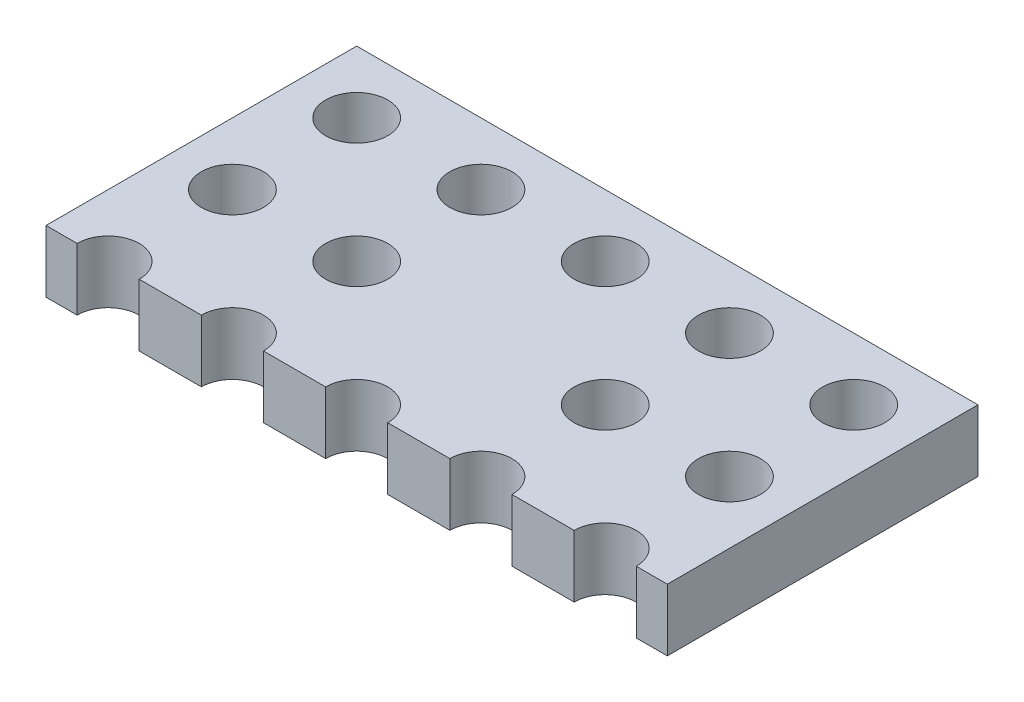
ISO-10303-21;
HEADER;
FILE_DESCRIPTION(('STEP AP214'),'2;1');
FILE_NAME('part.step','',(''),(''),'','','');
FILE_SCHEMA(('AUTOMOTIVE_DESIGN { 1 0 10303 214 1 1 1 1 }'));
ENDSEC;
DATA;
#1=APPLICATION_CONTEXT('core data for automotive mechanical design processes');
#2=APPLICATION_PROTOCOL_DEFINITION('international standard','automotive_design',2000,#1);
#3=PRODUCT_CONTEXT('',#1,'mechanical');
#4=PRODUCT('Part','Part','',(#3));
#5=PRODUCT_RELATED_PRODUCT_CATEGORY('part','',(#4));
#6=PRODUCT_DEFINITION_FORMATION('','',#4);
#7=PRODUCT_DEFINITION_CONTEXT('part definition',#1,'design');
#8=PRODUCT_DEFINITION('design','',#6,#7);
#9=PRODUCT_DEFINITION_SHAPE('','',#8);
#10=(LENGTH_UNIT() NAMED_UNIT(*) SI_UNIT(.MILLI.,.METRE.));
#11=(NAMED_UNIT(*) PLANE_ANGLE_UNIT() SI_UNIT($,.RADIAN.));
#12=(NAMED_UNIT(*) SI_UNIT($,.STERADIAN.) SOLID_ANGLE_UNIT());
#13=UNCERTAINTY_MEASURE_WITH_UNIT(LENGTH_MEASURE(1.E-05),#10,'distance_accuracy_value','');
#14=(GEOMETRIC_REPRESENTATION_CONTEXT(3) GLOBAL_UNCERTAINTY_ASSIGNED_CONTEXT((#13)) GLOBAL_UNIT_ASSIGNED_CONTEXT((#10,
#11,#12)) REPRESENTATION_CONTEXT('',''));
#15=CARTESIAN_POINT('',(0.,0.,0.));
#16=DIRECTION('',(0.,0.,1.));
#17=DIRECTION('',(1.,0.,0.));
#18=AXIS2_PLACEMENT_3D('',#15,#16,#17);
#19=CARTESIAN_POINT('',(-50.,10.,25.));
#20=DIRECTION('',(0.,0.,-1.));
#21=DIRECTION('',(-1.,0.,0.));
#22=AXIS2_PLACEMENT_3D('',#19,#20,#21);
#23=PLANE('',#22);
#24=DIRECTION('',(1.,0.,0.));
#25=VECTOR('',#24,1.);
#26=CARTESIAN_POINT('',(-50.,0.,25.));
#27=LINE('',#26,#25);
#28=CARTESIAN_POINT('',(-50.,0.,25.));
#29=VERTEX_POINT('',#28);
#30=CARTESIAN_POINT('',(-45.,0.,25.));
#31=VERTEX_POINT('',#30);
#32=EDGE_CURVE('E171',#29,#31,#27,.T.);
#33=ORIENTED_EDGE('',*,*,#32,.T.);
#34=DIRECTION('',(0.,1.,0.));
#35=VECTOR('',#34,1.);
#36=CARTESIAN_POINT('',(-45.,0.,25.));
#37=LINE('',#36,#35);
#38=CARTESIAN_POINT('',(-45.,10.,25.));
#39=VERTEX_POINT('',#38);
#40=EDGE_CURVE('E248',#31,#39,#37,.T.);
#41=ORIENTED_EDGE('',*,*,#40,.T.);
#42=DIRECTION('',(1.,0.,0.));
#43=VECTOR('',#42,1.);
#44=CARTESIAN_POINT('',(-50.,10.,25.));
#45=LINE('',#44,#43);
#46=CARTESIAN_POINT('',(-50.,10.,25.));
#47=VERTEX_POINT('',#46);
#48=EDGE_CURVE('E272',#47,#39,#45,.T.);
#49=ORIENTED_EDGE('',*,*,#48,.F.);
#50=DIRECTION('',(0.,-1.,0.));
#51=VECTOR('',#50,1.);
#52=CARTESIAN_POINT('',(-50.,10.,25.));
#53=LINE('',#52,#51);
#54=EDGE_CURVE('E295',#47,#29,#53,.T.);
#55=ORIENTED_EDGE('',*,*,#54,.T.);
#56=EDGE_LOOP('',(#33,#41,#49,#55));
#57=FACE_BOUND('',#56,.T.);
#58=ADVANCED_FACE('F39',(#57),#23,.F.);
#59=CARTESIAN_POINT('',(-35.,10.,25.));
#60=VERTEX_POINT('',#59);
#61=CARTESIAN_POINT('',(-25.,10.,25.));
#62=VERTEX_POINT('',#61);
#63=EDGE_CURVE('E277',#60,#62,#45,.T.);
#64=ORIENTED_EDGE('',*,*,#63,.F.);
#65=DIRECTION('',(0.,1.,0.));
#66=VECTOR('',#65,1.);
#67=CARTESIAN_POINT('',(-35.,0.,25.));
#68=LINE('',#67,#66);
#69=CARTESIAN_POINT('',(-35.,0.,25.));
#70=VERTEX_POINT('',#69);
#71=EDGE_CURVE('E245',#60,#70,#68,.F.);
#72=ORIENTED_EDGE('',*,*,#71,.T.);
#73=CARTESIAN_POINT('',(-25.,0.,25.));
#74=VERTEX_POINT('',#73);
#75=EDGE_CURVE('E181',#70,#74,#27,.T.);
#76=ORIENTED_EDGE('',*,*,#75,.T.);
#77=DIRECTION('',(0.,1.,0.));
#78=VECTOR('',#77,1.);
#79=CARTESIAN_POINT('',(-25.,0.,25.));
#80=LINE('',#79,#78);
#81=EDGE_CURVE('E242',#74,#62,#80,.T.);
#82=ORIENTED_EDGE('',*,*,#81,.T.);
#83=EDGE_LOOP('',(#64,#72,#76,#82));
#84=FACE_BOUND('',#83,.T.);
#85=ADVANCED_FACE('F319',(#84),#23,.F.);
#86=CARTESIAN_POINT('',(-15.,10.,25.));
#87=VERTEX_POINT('',#86);
#88=CARTESIAN_POINT('',(-4.99999999999999,10.,25.));
#89=VERTEX_POINT('',#88);
#90=EDGE_CURVE('E324',#87,#89,#45,.T.);
#91=ORIENTED_EDGE('',*,*,#90,.F.);
#92=DIRECTION('',(0.,1.,0.));
#93=VECTOR('',#92,1.);
#94=CARTESIAN_POINT('',(-15.,0.,25.));
#95=LINE('',#94,#93);
#96=CARTESIAN_POINT('',(-15.,0.,25.));
#97=VERTEX_POINT('',#96);
#98=EDGE_CURVE('E239',#87,#97,#95,.F.);
#99=ORIENTED_EDGE('',*,*,#98,.T.);
#100=CARTESIAN_POINT('',(-4.99999999999999,0.,25.));
#101=VERTEX_POINT('',#100);
#102=EDGE_CURVE('E192',#97,#101,#27,.T.);
#103=ORIENTED_EDGE('',*,*,#102,.T.);
#104=DIRECTION('',(0.,1.,0.));
#105=VECTOR('',#104,1.);
#106=CARTESIAN_POINT('',(-4.99999999999999,0.,25.));
#107=LINE('',#106,#105);
#108=EDGE_CURVE('E236',#101,#89,#107,.T.);
#109=ORIENTED_EDGE('',*,*,#108,.T.);
#110=EDGE_LOOP('',(#91,#99,#103,#109));
#111=FACE_BOUND('',#110,.T.);
#112=ADVANCED_FACE('F418',(#111),#23,.F.);
#113=CARTESIAN_POINT('',(5.,10.,25.));
#114=VERTEX_POINT('',#113);
#115=CARTESIAN_POINT('',(15.,10.,25.));
#116=VERTEX_POINT('',#115);
#117=EDGE_CURVE('E326',#114,#116,#45,.T.);
#118=ORIENTED_EDGE('',*,*,#117,.F.);
#119=DIRECTION('',(0.,1.,0.));
#120=VECTOR('',#119,1.);
#121=CARTESIAN_POINT('',(5.,0.,25.));
#122=LINE('',#121,#120);
#123=CARTESIAN_POINT('',(5.,0.,25.));
#124=VERTEX_POINT('',#123);
#125=EDGE_CURVE('E211',#114,#124,#122,.F.);
#126=ORIENTED_EDGE('',*,*,#125,.T.);
#127=CARTESIAN_POINT('',(15.,0.,25.));
#128=VERTEX_POINT('',#127);
#129=EDGE_CURVE('E174',#124,#128,#27,.T.);
#130=ORIENTED_EDGE('',*,*,#129,.T.);
#131=DIRECTION('',(0.,1.,0.));
#132=VECTOR('',#131,1.);
#133=CARTESIAN_POINT('',(15.,0.,25.));
#134=LINE('',#133,#132);
#135=EDGE_CURVE('E63',#128,#116,#134,.T.);
#136=ORIENTED_EDGE('',*,*,#135,.T.);
#137=EDGE_LOOP('',(#118,#126,#130,#136));
#138=FACE_BOUND('',#137,.T.);
#139=ADVANCED_FACE('F209',(#138),#23,.F.);
#140=CARTESIAN_POINT('',(25.,10.,25.));
#141=VERTEX_POINT('',#140);
#142=CARTESIAN_POINT('',(35.,10.,25.));
#143=VERTEX_POINT('',#142);
#144=EDGE_CURVE('E329',#141,#143,#45,.T.);
#145=ORIENTED_EDGE('',*,*,#144,.F.);
#146=DIRECTION('',(0.,1.,0.));
#147=VECTOR('',#146,1.);
#148=CARTESIAN_POINT('',(25.,0.,25.));
#149=LINE('',#148,#147);
#150=CARTESIAN_POINT('',(25.,0.,25.));
#151=VERTEX_POINT('',#150);
#152=EDGE_CURVE('E229',#141,#151,#149,.F.);
#153=ORIENTED_EDGE('',*,*,#152,.T.);
#154=CARTESIAN_POINT('',(35.,0.,25.));
#155=VERTEX_POINT('',#154);
#156=EDGE_CURVE('E168',#151,#155,#27,.T.);
#157=ORIENTED_EDGE('',*,*,#156,.T.);
#158=DIRECTION('',(0.,1.,0.));
#159=VECTOR('',#158,1.);
#160=CARTESIAN_POINT('',(35.,0.,25.));
#161=LINE('',#160,#159);
#162=EDGE_CURVE('E55',#155,#143,#161,.T.);
#163=ORIENTED_EDGE('',*,*,#162,.T.);
#164=EDGE_LOOP('',(#145,#153,#157,#163));
#165=FACE_BOUND('',#164,.T.);
#166=ADVANCED_FACE('F398',(#165),#23,.F.);
#167=CARTESIAN_POINT('',(40.,0.,5.00000000000001));
#168=DIRECTION('',(0.,1.,0.));
#169=DIRECTION('',(0.,0.,1.));
#170=AXIS2_PLACEMENT_3D('',#167,#168,#169);
#171=CYLINDRICAL_SURFACE('',#170,5.);
#172=CARTESIAN_POINT('',(40.,0.,5.00000000000001));
#173=DIRECTION('',(0.,1.,0.));
#174=DIRECTION('',(0.,0.,1.));
#175=AXIS2_PLACEMENT_3D('',#172,#173,#174);
#176=CIRCLE('',#175,5.);
#177=CARTESIAN_POINT('',(40.,0.,10.));
#178=VERTEX_POINT('',#177);
#179=EDGE_CURVE('E48',#178,#178,#176,.T.);
#180=ORIENTED_EDGE('',*,*,#179,.F.);
#181=EDGE_LOOP('',(#180));
#182=FACE_BOUND('',#181,.T.);
#183=CARTESIAN_POINT('',(40.,10.,5.00000000000001));
#184=DIRECTION('',(0.,1.,0.));
#185=DIRECTION('',(0.,0.,1.));
#186=AXIS2_PLACEMENT_3D('',#183,#184,#185);
#187=CIRCLE('',#186,5.);
#188=CARTESIAN_POINT('',(40.,10.,10.));
#189=VERTEX_POINT('',#188);
#190=EDGE_CURVE('E11',#189,#189,#187,.T.);
#191=ORIENTED_EDGE('',*,*,#190,.T.);
#192=EDGE_LOOP('',(#191));
#193=FACE_BOUND('',#192,.T.);
#194=ADVANCED_FACE('F41',(#182,#193),#171,.F.);
#195=CARTESIAN_POINT('',(-40.,0.,5.));
#196=DIRECTION('',(0.,1.,0.));
#197=DIRECTION('',(0.,0.,1.));
#198=AXIS2_PLACEMENT_3D('',#195,#196,#197);
#199=CYLINDRICAL_SURFACE('',#198,5.);
#200=CARTESIAN_POINT('',(-40.,0.,5.));
#201=DIRECTION('',(0.,1.,0.));
#202=DIRECTION('',(0.,0.,1.));
#203=AXIS2_PLACEMENT_3D('',#200,#201,#202);
#204=CIRCLE('',#203,5.);
#205=CARTESIAN_POINT('',(-40.,0.,10.));
#206=VERTEX_POINT('',#205);
#207=EDGE_CURVE('E383',#206,#206,#204,.T.);
#208=ORIENTED_EDGE('',*,*,#207,.F.);
#209=EDGE_LOOP('',(#208));
#210=FACE_BOUND('',#209,.T.);
#211=CARTESIAN_POINT('',(-40.,10.,5.));
#212=DIRECTION('',(0.,1.,0.));
#213=DIRECTION('',(0.,0.,1.));
#214=AXIS2_PLACEMENT_3D('',#211,#212,#213);
#215=CIRCLE('',#214,5.);
#216=CARTESIAN_POINT('',(-40.,10.,10.));
#217=VERTEX_POINT('',#216);
#218=EDGE_CURVE('E387',#217,#217,#215,.T.);
#219=ORIENTED_EDGE('',*,*,#218,.T.);
#220=EDGE_LOOP('',(#219));
#221=FACE_BOUND('',#220,.T.);
#222=ADVANCED_FACE('F397',(#210,#221),#199,.F.);
#223=CARTESIAN_POINT('',(40.,0.,-15.));
#224=DIRECTION('',(0.,1.,0.));
#225=DIRECTION('',(0.,0.,1.));
#226=AXIS2_PLACEMENT_3D('',#223,#224,#225);
#227=CYLINDRICAL_SURFACE('',#226,5.);
#228=CARTESIAN_POINT('',(40.,0.,-15.));
#229=DIRECTION('',(0.,1.,0.));
#230=DIRECTION('',(0.,0.,1.));
#231=AXIS2_PLACEMENT_3D('',#228,#229,#230);
#232=CIRCLE('',#231,5.);
#233=CARTESIAN_POINT('',(40.,0.,-10.));
#234=VERTEX_POINT('',#233);
#235=EDGE_CURVE('E375',#234,#234,#232,.T.);
#236=ORIENTED_EDGE('',*,*,#235,.F.);
#237=EDGE_LOOP('',(#236));
#238=FACE_BOUND('',#237,.T.);
#239=CARTESIAN_POINT('',(40.,10.,-15.));
#240=DIRECTION('',(0.,1.,0.));
#241=DIRECTION('',(0.,0.,1.));
#242=AXIS2_PLACEMENT_3D('',#239,#240,#241);
#243=CIRCLE('',#242,5.);
#244=CARTESIAN_POINT('',(40.,10.,-10.));
#245=VERTEX_POINT('',#244);
#246=EDGE_CURVE('E379',#245,#245,#243,.T.);
#247=ORIENTED_EDGE('',*,*,#246,.T.);
#248=EDGE_LOOP('',(#247));
#249=FACE_BOUND('',#248,.T.);
#250=ADVANCED_FACE('F441',(#238,#249),#227,.F.);
#251=CARTESIAN_POINT('',(20.,0.,-15.));
#252=DIRECTION('',(0.,1.,0.));
#253=DIRECTION('',(0.,0.,1.));
#254=AXIS2_PLACEMENT_3D('',#251,#252,#253);
#255=CYLINDRICAL_SURFACE('',#254,5.);
#256=CARTESIAN_POINT('',(20.,0.,-15.));
#257=DIRECTION('',(0.,1.,0.));
#258=DIRECTION('',(0.,0.,1.));
#259=AXIS2_PLACEMENT_3D('',#256,#257,#258);
#260=CIRCLE('',#259,5.);
#261=CARTESIAN_POINT('',(20.,0.,-10.));
#262=VERTEX_POINT('',#261);
#263=EDGE_CURVE('E367',#262,#262,#260,.T.);
#264=ORIENTED_EDGE('',*,*,#263,.F.);
#265=EDGE_LOOP('',(#264));
#266=FACE_BOUND('',#265,.T.);
#267=CARTESIAN_POINT('',(20.,10.,-15.));
#268=DIRECTION('',(0.,1.,0.));
#269=DIRECTION('',(0.,0.,1.));
#270=AXIS2_PLACEMENT_3D('',#267,#268,#269);
#271=CIRCLE('',#270,5.);
#272=CARTESIAN_POINT('',(20.,10.,-10.));
#273=VERTEX_POINT('',#272);
#274=EDGE_CURVE('E371',#273,#273,#271,.T.);
#275=ORIENTED_EDGE('',*,*,#274,.T.);
#276=EDGE_LOOP('',(#275));
#277=FACE_BOUND('',#276,.T.);
#278=ADVANCED_FACE('F437',(#266,#277),#255,.F.);
#279=CARTESIAN_POINT('',(0.,0.,-15.));
#280=DIRECTION('',(0.,1.,0.));
#281=DIRECTION('',(0.,0.,1.));
#282=AXIS2_PLACEMENT_3D('',#279,#280,#281);
#283=CYLINDRICAL_SURFACE('',#282,5.);
#284=CARTESIAN_POINT('',(0.,0.,-15.));
#285=DIRECTION('',(0.,1.,0.));
#286=DIRECTION('',(0.,0.,1.));
#287=AXIS2_PLACEMENT_3D('',#284,#285,#286);
#288=CIRCLE('',#287,5.);
#289=CARTESIAN_POINT('',(0.,0.,-10.));
#290=VERTEX_POINT('',#289);
#291=EDGE_CURVE('E359',#290,#290,#288,.T.);
#292=ORIENTED_EDGE('',*,*,#291,.F.);
#293=EDGE_LOOP('',(#292));
#294=FACE_BOUND('',#293,.T.);
#295=CARTESIAN_POINT('',(0.,10.,-15.));
#296=DIRECTION('',(0.,1.,0.));
#297=DIRECTION('',(0.,0.,1.));
#298=AXIS2_PLACEMENT_3D('',#295,#296,#297);
#299=CIRCLE('',#298,5.);
#300=CARTESIAN_POINT('',(0.,10.,-10.));
#301=VERTEX_POINT('',#300);
#302=EDGE_CURVE('E363',#301,#301,#299,.T.);
#303=ORIENTED_EDGE('',*,*,#302,.T.);
#304=EDGE_LOOP('',(#303));
#305=FACE_BOUND('',#304,.T.);
#306=ADVANCED_FACE('F433',(#294,#305),#283,.F.);
#307=CARTESIAN_POINT('',(-20.,0.,-15.));
#308=DIRECTION('',(0.,1.,0.));
#309=DIRECTION('',(0.,0.,1.));
#310=AXIS2_PLACEMENT_3D('',#307,#308,#309);
#311=CYLINDRICAL_SURFACE('',#310,5.);
#312=CARTESIAN_POINT('',(-20.,0.,-15.));
#313=DIRECTION('',(0.,1.,0.));
#314=DIRECTION('',(0.,0.,1.));
#315=AXIS2_PLACEMENT_3D('',#312,#313,#314);
#316=CIRCLE('',#315,5.);
#317=CARTESIAN_POINT('',(-20.,0.,-10.));
#318=VERTEX_POINT('',#317);
#319=EDGE_CURVE('E351',#318,#318,#316,.T.);
#320=ORIENTED_EDGE('',*,*,#319,.F.);
#321=EDGE_LOOP('',(#320));
#322=FACE_BOUND('',#321,.T.);
#323=CARTESIAN_POINT('',(-20.,10.,-15.));
#324=DIRECTION('',(0.,1.,0.));
#325=DIRECTION('',(0.,0.,1.));
#326=AXIS2_PLACEMENT_3D('',#323,#324,#325);
#327=CIRCLE('',#326,5.);
#328=CARTESIAN_POINT('',(-20.,10.,-10.));
#329=VERTEX_POINT('',#328);
#330=EDGE_CURVE('E355',#329,#329,#327,.T.);
#331=ORIENTED_EDGE('',*,*,#330,.T.);
#332=EDGE_LOOP('',(#331));
#333=FACE_BOUND('',#332,.T.);
#334=ADVANCED_FACE('F429',(#322,#333),#311,.F.);
#335=CARTESIAN_POINT('',(20.,0.,5.00000000000001));
#336=DIRECTION('',(0.,1.,0.));
#337=DIRECTION('',(0.,0.,1.));
#338=AXIS2_PLACEMENT_3D('',#335,#336,#337);
#339=CYLINDRICAL_SURFACE('',#338,5.);
#340=CARTESIAN_POINT('',(20.,0.,5.00000000000001));
#341=DIRECTION('',(0.,1.,0.));
#342=DIRECTION('',(0.,0.,1.));
#343=AXIS2_PLACEMENT_3D('',#340,#341,#342);
#344=CIRCLE('',#343,5.);
#345=CARTESIAN_POINT('',(20.,0.,10.));
#346=VERTEX_POINT('',#345);
#347=EDGE_CURVE('E340',#346,#346,#344,.T.);
#348=ORIENTED_EDGE('',*,*,#347,.F.);
#349=EDGE_LOOP('',(#348));
#350=FACE_BOUND('',#349,.T.);
#351=CARTESIAN_POINT('',(20.,10.,5.00000000000001));
#352=DIRECTION('',(0.,1.,0.));
#353=DIRECTION('',(0.,0.,1.));
#354=AXIS2_PLACEMENT_3D('',#351,#352,#353);
#355=CIRCLE('',#354,5.);
#356=CARTESIAN_POINT('',(20.,10.,10.));
#357=VERTEX_POINT('',#356);
#358=EDGE_CURVE('E344',#357,#357,#355,.T.);
#359=ORIENTED_EDGE('',*,*,#358,.T.);
#360=EDGE_LOOP('',(#359));
#361=FACE_BOUND('',#360,.T.);
#362=ADVANCED_FACE('F426',(#350,#361),#339,.F.);
#363=CARTESIAN_POINT('',(50.,10.,25.));
#364=DIRECTION('',(-1.,0.,0.));
#365=DIRECTION('',(0.,0.,1.));
#366=AXIS2_PLACEMENT_3D('',#363,#364,#365);
#367=PLANE('',#366);
#368=DIRECTION('',(0.,0.,-1.));
#369=VECTOR('',#368,1.);
#370=CARTESIAN_POINT('',(50.,0.,25.));
#371=LINE('',#370,#369);
#372=CARTESIAN_POINT('',(50.,0.,25.));
#373=VERTEX_POINT('',#372);
#374=CARTESIAN_POINT('',(50.,0.,-25.));
#375=VERTEX_POINT('',#374);
#376=EDGE_CURVE('E166',#373,#375,#371,.T.);
#377=ORIENTED_EDGE('',*,*,#376,.T.);
#378=DIRECTION('',(0.,-1.,0.));
#379=VECTOR('',#378,1.);
#380=CARTESIAN_POINT('',(50.,10.,-25.));
#381=LINE('',#380,#379);
#382=CARTESIAN_POINT('',(50.,10.,-25.));
#383=VERTEX_POINT('',#382);
#384=EDGE_CURVE('E289',#383,#375,#381,.T.);
#385=ORIENTED_EDGE('',*,*,#384,.F.);
#386=DIRECTION('',(0.,0.,-1.));
#387=VECTOR('',#386,1.);
#388=CARTESIAN_POINT('',(50.,10.,25.));
#389=LINE('',#388,#387);
#390=CARTESIAN_POINT('',(50.,10.,25.));
#391=VERTEX_POINT('',#390);
#392=EDGE_CURVE('E180',#391,#383,#389,.T.);
#393=ORIENTED_EDGE('',*,*,#392,.F.);
#394=DIRECTION('',(0.,-1.,0.));
#395=VECTOR('',#394,1.);
#396=CARTESIAN_POINT('',(50.,10.,25.));
#397=LINE('',#396,#395);
#398=EDGE_CURVE('E276',#391,#373,#397,.T.);
#399=ORIENTED_EDGE('',*,*,#398,.T.);
#400=EDGE_LOOP('',(#377,#385,#393,#399));
#401=FACE_BOUND('',#400,.T.);
#402=ADVANCED_FACE('F338',(#401),#367,.F.);
#403=CARTESIAN_POINT('',(-50.,10.,-25.));
#404=DIRECTION('',(0.,0.,1.));
#405=DIRECTION('',(1.,0.,0.));
#406=AXIS2_PLACEMENT_3D('',#403,#404,#405);
#407=PLANE('',#406);
#408=DIRECTION('',(-1.,0.,0.));
#409=VECTOR('',#408,1.);
#410=CARTESIAN_POINT('',(-50.,0.,-25.));
#411=LINE('',#410,#409);
#412=CARTESIAN_POINT('',(-50.,0.,-25.));
#413=VERTEX_POINT('',#412);
#414=EDGE_CURVE('E175',#375,#413,#411,.T.);
#415=ORIENTED_EDGE('',*,*,#414,.T.);
#416=DIRECTION('',(0.,-1.,0.));
#417=VECTOR('',#416,1.);
#418=CARTESIAN_POINT('',(-50.,10.,-25.));
#419=LINE('',#418,#417);
#420=CARTESIAN_POINT('',(-50.,10.,-25.));
#421=VERTEX_POINT('',#420);
#422=EDGE_CURVE('E286',#421,#413,#419,.T.);
#423=ORIENTED_EDGE('',*,*,#422,.F.);
#424=DIRECTION('',(-1.,0.,0.));
#425=VECTOR('',#424,1.);
#426=CARTESIAN_POINT('',(-50.,10.,-25.));
#427=LINE('',#426,#425);
#428=EDGE_CURVE('E189',#383,#421,#427,.T.);
#429=ORIENTED_EDGE('',*,*,#428,.F.);
#430=ORIENTED_EDGE('',*,*,#384,.T.);
#431=EDGE_LOOP('',(#415,#423,#429,#430));
#432=FACE_BOUND('',#431,.T.);
#433=ADVANCED_FACE('F285',(#432),#407,.F.);
#434=CARTESIAN_POINT('',(-50.,10.,25.));
#435=DIRECTION('',(1.,0.,0.));
#436=DIRECTION('',(0.,0.,-1.));
#437=AXIS2_PLACEMENT_3D('',#434,#435,#436);
#438=PLANE('',#437);
#439=DIRECTION('',(0.,0.,1.));
#440=VECTOR('',#439,1.);
#441=CARTESIAN_POINT('',(-50.,0.,25.));
#442=LINE('',#441,#440);
#443=EDGE_CURVE('E169',#413,#29,#442,.T.);
#444=ORIENTED_EDGE('',*,*,#443,.T.);
#445=ORIENTED_EDGE('',*,*,#54,.F.);
#446=DIRECTION('',(0.,0.,1.));
#447=VECTOR('',#446,1.);
#448=CARTESIAN_POINT('',(-50.,10.,25.));
#449=LINE('',#448,#447);
#450=EDGE_CURVE('E269',#421,#47,#449,.T.);
#451=ORIENTED_EDGE('',*,*,#450,.F.);
#452=ORIENTED_EDGE('',*,*,#422,.T.);
#453=EDGE_LOOP('',(#444,#445,#451,#452));
#454=FACE_BOUND('',#453,.T.);
#455=ADVANCED_FACE('F292',(#454),#438,.F.);
#456=CARTESIAN_POINT('',(45.,10.,25.));
#457=VERTEX_POINT('',#456);
#458=EDGE_CURVE('E157',#457,#391,#45,.T.);
#459=ORIENTED_EDGE('',*,*,#458,.F.);
#460=DIRECTION('',(0.,1.,0.));
#461=VECTOR('',#460,1.);
#462=CARTESIAN_POINT('',(45.,0.,25.));
#463=LINE('',#462,#461);
#464=CARTESIAN_POINT('',(45.,0.,25.));
#465=VERTEX_POINT('',#464);
#466=EDGE_CURVE('E141',#457,#465,#463,.F.);
#467=ORIENTED_EDGE('',*,*,#466,.T.);
#468=EDGE_CURVE('E155',#465,#373,#27,.T.);
#469=ORIENTED_EDGE('',*,*,#468,.T.);
#470=ORIENTED_EDGE('',*,*,#398,.F.);
#471=EDGE_LOOP('',(#459,#467,#469,#470));
#472=FACE_BOUND('',#471,.T.);
#473=ADVANCED_FACE('F153',(#472),#23,.F.);
#474=CARTESIAN_POINT('',(0.,10.,0.));
#475=DIRECTION('',(0.,-1.,0.));
#476=DIRECTION('',(0.,0.,-1.));
#477=AXIS2_PLACEMENT_3D('',#474,#475,#476);
#478=PLANE('',#477);
#479=CARTESIAN_POINT('',(-20.,10.,5.));
#480=DIRECTION('',(0.,1.,0.));
#481=DIRECTION('',(0.,0.,1.));
#482=AXIS2_PLACEMENT_3D('',#479,#480,#481);
#483=CIRCLE('',#482,5.);
#484=CARTESIAN_POINT('',(-20.,10.,10.));
#485=VERTEX_POINT('',#484);
#486=EDGE_CURVE('E255',#485,#485,#483,.T.);
#487=ORIENTED_EDGE('',*,*,#486,.F.);
#488=EDGE_LOOP('',(#487));
#489=FACE_BOUND('',#488,.T.);
#490=CARTESIAN_POINT('',(-40.,10.,-15.));
#491=DIRECTION('',(0.,1.,0.));
#492=DIRECTION('',(0.,0.,1.));
#493=AXIS2_PLACEMENT_3D('',#490,#491,#492);
#494=CIRCLE('',#493,5.);
#495=CARTESIAN_POINT('',(-40.,10.,-10.));
#496=VERTEX_POINT('',#495);
#497=EDGE_CURVE('E259',#496,#496,#494,.T.);
#498=ORIENTED_EDGE('',*,*,#497,.F.);
#499=EDGE_LOOP('',(#498));
#500=FACE_BOUND('',#499,.T.);
#501=ORIENTED_EDGE('',*,*,#48,.T.);
#502=CARTESIAN_POINT('',(-40.,10.,25.));
#503=DIRECTION('',(0.,1.,0.));
#504=DIRECTION('',(0.,0.,1.));
#505=AXIS2_PLACEMENT_3D('',#502,#503,#504);
#506=CIRCLE('',#505,5.);
#507=EDGE_CURVE('E300',#60,#39,#506,.T.);
#508=ORIENTED_EDGE('',*,*,#507,.F.);
#509=ORIENTED_EDGE('',*,*,#63,.T.);
#510=CARTESIAN_POINT('',(-20.,10.,25.));
#511=DIRECTION('',(0.,1.,0.));
#512=DIRECTION('',(0.,0.,1.));
#513=AXIS2_PLACEMENT_3D('',#510,#511,#512);
#514=CIRCLE('',#513,5.);
#515=EDGE_CURVE('E308',#87,#62,#514,.T.);
#516=ORIENTED_EDGE('',*,*,#515,.F.);
#517=ORIENTED_EDGE('',*,*,#90,.T.);
#518=CARTESIAN_POINT('',(0.,10.,25.));
#519=DIRECTION('',(0.,1.,0.));
#520=DIRECTION('',(0.,0.,1.));
#521=AXIS2_PLACEMENT_3D('',#518,#519,#520);
#522=CIRCLE('',#521,5.);
#523=EDGE_CURVE('E217',#114,#89,#522,.T.);
#524=ORIENTED_EDGE('',*,*,#523,.F.);
#525=ORIENTED_EDGE('',*,*,#117,.T.);
#526=CARTESIAN_POINT('',(20.,10.,25.));
#527=DIRECTION('',(0.,1.,0.));
#528=DIRECTION('',(0.,0.,1.));
#529=AXIS2_PLACEMENT_3D('',#526,#527,#528);
#530=CIRCLE('',#529,5.);
#531=EDGE_CURVE('E148',#141,#116,#530,.T.);
#532=ORIENTED_EDGE('',*,*,#531,.F.);
#533=ORIENTED_EDGE('',*,*,#144,.T.);
#534=CARTESIAN_POINT('',(40.,10.,25.));
#535=DIRECTION('',(0.,1.,0.));
#536=DIRECTION('',(0.,0.,1.));
#537=AXIS2_PLACEMENT_3D('',#534,#535,#536);
#538=CIRCLE('',#537,5.);
#539=EDGE_CURVE('E149',#457,#143,#538,.T.);
#540=ORIENTED_EDGE('',*,*,#539,.F.);
#541=ORIENTED_EDGE('',*,*,#458,.T.);
#542=ORIENTED_EDGE('',*,*,#392,.T.);
#543=ORIENTED_EDGE('',*,*,#428,.T.);
#544=ORIENTED_EDGE('',*,*,#450,.T.);
#545=EDGE_LOOP('',(#501,#508,#509,#516,#517,#524,#525,#532,#533,#540,#541,#542,#543,#544));
#546=FACE_BOUND('',#545,.T.);
#547=ORIENTED_EDGE('',*,*,#358,.F.);
#548=EDGE_LOOP('',(#547));
#549=FACE_BOUND('',#548,.T.);
#550=ORIENTED_EDGE('',*,*,#330,.F.);
#551=EDGE_LOOP('',(#550));
#552=FACE_BOUND('',#551,.T.);
#553=ORIENTED_EDGE('',*,*,#302,.F.);
#554=EDGE_LOOP('',(#553));
#555=FACE_BOUND('',#554,.T.);
#556=ORIENTED_EDGE('',*,*,#274,.F.);
#557=EDGE_LOOP('',(#556));
#558=FACE_BOUND('',#557,.T.);
#559=ORIENTED_EDGE('',*,*,#246,.F.);
#560=EDGE_LOOP('',(#559));
#561=FACE_BOUND('',#560,.T.);
#562=ORIENTED_EDGE('',*,*,#218,.F.);
#563=EDGE_LOOP('',(#562));
#564=FACE_BOUND('',#563,.T.);
#565=ORIENTED_EDGE('',*,*,#190,.F.);
#566=EDGE_LOOP('',(#565));
#567=FACE_BOUND('',#566,.T.);
#568=ADVANCED_FACE('F321',(#489,#500,#546,#549,#552,#555,#558,#561,#564,#567),#478,.F.);
#569=CARTESIAN_POINT('',(0.,0.,0.));
#570=DIRECTION('',(0.,-1.,0.));
#571=DIRECTION('',(0.,0.,-1.));
#572=AXIS2_PLACEMENT_3D('',#569,#570,#571);
#573=PLANE('',#572);
#574=CARTESIAN_POINT('',(-40.,0.,25.));
#575=DIRECTION('',(0.,1.,0.));
#576=DIRECTION('',(0.,0.,1.));
#577=AXIS2_PLACEMENT_3D('',#574,#575,#576);
#578=CIRCLE('',#577,5.);
#579=EDGE_CURVE('E159',#70,#31,#578,.T.);
#580=ORIENTED_EDGE('',*,*,#579,.T.);
#581=ORIENTED_EDGE('',*,*,#32,.F.);
#582=ORIENTED_EDGE('',*,*,#443,.F.);
#583=ORIENTED_EDGE('',*,*,#414,.F.);
#584=ORIENTED_EDGE('',*,*,#376,.F.);
#585=ORIENTED_EDGE('',*,*,#468,.F.);
#586=CARTESIAN_POINT('',(40.,0.,25.));
#587=DIRECTION('',(0.,1.,0.));
#588=DIRECTION('',(0.,0.,1.));
#589=AXIS2_PLACEMENT_3D('',#586,#587,#588);
#590=CIRCLE('',#589,5.);
#591=EDGE_CURVE('E138',#465,#155,#590,.T.);
#592=ORIENTED_EDGE('',*,*,#591,.T.);
#593=ORIENTED_EDGE('',*,*,#156,.F.);
#594=CARTESIAN_POINT('',(20.,0.,25.));
#595=DIRECTION('',(0.,1.,0.));
#596=DIRECTION('',(0.,0.,1.));
#597=AXIS2_PLACEMENT_3D('',#594,#595,#596);
#598=CIRCLE('',#597,5.);
#599=EDGE_CURVE('E214',#151,#128,#598,.T.);
#600=ORIENTED_EDGE('',*,*,#599,.T.);
#601=ORIENTED_EDGE('',*,*,#129,.F.);
#602=CARTESIAN_POINT('',(0.,0.,25.));
#603=DIRECTION('',(0.,1.,0.));
#604=DIRECTION('',(0.,0.,1.));
#605=AXIS2_PLACEMENT_3D('',#602,#603,#604);
#606=CIRCLE('',#605,5.);
#607=EDGE_CURVE('E213',#124,#101,#606,.T.);
#608=ORIENTED_EDGE('',*,*,#607,.T.);
#609=ORIENTED_EDGE('',*,*,#102,.F.);
#610=CARTESIAN_POINT('',(-20.,0.,25.));
#611=DIRECTION('',(0.,1.,0.));
#612=DIRECTION('',(0.,0.,1.));
#613=AXIS2_PLACEMENT_3D('',#610,#611,#612);
#614=CIRCLE('',#613,5.);
#615=EDGE_CURVE('E303',#97,#74,#614,.T.);
#616=ORIENTED_EDGE('',*,*,#615,.T.);
#617=ORIENTED_EDGE('',*,*,#75,.F.);
#618=EDGE_LOOP('',(#580,#581,#582,#583,#584,#585,#592,#593,#600,#601,#608,#609,#616,#617));
#619=FACE_BOUND('',#618,.T.);
#620=CARTESIAN_POINT('',(-20.,0.,5.));
#621=DIRECTION('',(0.,1.,0.));
#622=DIRECTION('',(0.,0.,1.));
#623=AXIS2_PLACEMENT_3D('',#620,#621,#622);
#624=CIRCLE('',#623,5.);
#625=CARTESIAN_POINT('',(-20.,0.,10.));
#626=VERTEX_POINT('',#625);
#627=EDGE_CURVE('E251',#626,#626,#624,.T.);
#628=ORIENTED_EDGE('',*,*,#627,.T.);
#629=EDGE_LOOP('',(#628));
#630=FACE_BOUND('',#629,.T.);
#631=CARTESIAN_POINT('',(-40.,0.,-15.));
#632=DIRECTION('',(0.,1.,0.));
#633=DIRECTION('',(0.,0.,1.));
#634=AXIS2_PLACEMENT_3D('',#631,#632,#633);
#635=CIRCLE('',#634,5.);
#636=CARTESIAN_POINT('',(-40.,0.,-10.));
#637=VERTEX_POINT('',#636);
#638=EDGE_CURVE('E260',#637,#637,#635,.T.);
#639=ORIENTED_EDGE('',*,*,#638,.T.);
#640=EDGE_LOOP('',(#639));
#641=FACE_BOUND('',#640,.T.);
#642=ORIENTED_EDGE('',*,*,#347,.T.);
#643=EDGE_LOOP('',(#642));
#644=FACE_BOUND('',#643,.T.);
#645=ORIENTED_EDGE('',*,*,#319,.T.);
#646=EDGE_LOOP('',(#645));
#647=FACE_BOUND('',#646,.T.);
#648=ORIENTED_EDGE('',*,*,#291,.T.);
#649=EDGE_LOOP('',(#648));
#650=FACE_BOUND('',#649,.T.);
#651=ORIENTED_EDGE('',*,*,#263,.T.);
#652=EDGE_LOOP('',(#651));
#653=FACE_BOUND('',#652,.T.);
#654=ORIENTED_EDGE('',*,*,#235,.T.);
#655=EDGE_LOOP('',(#654));
#656=FACE_BOUND('',#655,.T.);
#657=ORIENTED_EDGE('',*,*,#207,.T.);
#658=EDGE_LOOP('',(#657));
#659=FACE_BOUND('',#658,.T.);
#660=ORIENTED_EDGE('',*,*,#179,.T.);
#661=EDGE_LOOP('',(#660));
#662=FACE_BOUND('',#661,.T.);
#663=ADVANCED_FACE('F163',(#619,#630,#641,#644,#647,#650,#653,#656,#659,#662),#573,.T.);
#664=CARTESIAN_POINT('',(-40.,0.,-15.));
#665=DIRECTION('',(0.,1.,0.));
#666=DIRECTION('',(0.,0.,1.));
#667=AXIS2_PLACEMENT_3D('',#664,#665,#666);
#668=CYLINDRICAL_SURFACE('',#667,5.);
#669=ORIENTED_EDGE('',*,*,#638,.F.);
#670=EDGE_LOOP('',(#669));
#671=FACE_BOUND('',#670,.T.);
#672=ORIENTED_EDGE('',*,*,#497,.T.);
#673=EDGE_LOOP('',(#672));
#674=FACE_BOUND('',#673,.T.);
#675=ADVANCED_FACE('F408',(#671,#674),#668,.F.);
#676=CARTESIAN_POINT('',(-20.,0.,5.));
#677=DIRECTION('',(0.,1.,0.));
#678=DIRECTION('',(0.,0.,1.));
#679=AXIS2_PLACEMENT_3D('',#676,#677,#678);
#680=CYLINDRICAL_SURFACE('',#679,5.);
#681=ORIENTED_EDGE('',*,*,#627,.F.);
#682=EDGE_LOOP('',(#681));
#683=FACE_BOUND('',#682,.T.);
#684=ORIENTED_EDGE('',*,*,#486,.T.);
#685=EDGE_LOOP('',(#684));
#686=FACE_BOUND('',#685,.T.);
#687=ADVANCED_FACE('F511',(#683,#686),#680,.F.);
#688=CARTESIAN_POINT('',(40.,0.,25.));
#689=DIRECTION('',(0.,1.,0.));
#690=DIRECTION('',(0.,0.,1.));
#691=AXIS2_PLACEMENT_3D('',#688,#689,#690);
#692=CYLINDRICAL_SURFACE('',#691,5.);
#693=ORIENTED_EDGE('',*,*,#591,.F.);
#694=ORIENTED_EDGE('',*,*,#466,.F.);
#695=ORIENTED_EDGE('',*,*,#539,.T.);
#696=ORIENTED_EDGE('',*,*,#162,.F.);
#697=EDGE_LOOP('',(#693,#694,#695,#696));
#698=FACE_BOUND('',#697,.T.);
#699=ADVANCED_FACE('F140',(#698),#692,.F.);
#700=CARTESIAN_POINT('',(20.,0.,25.));
#701=DIRECTION('',(0.,1.,0.));
#702=DIRECTION('',(0.,0.,1.));
#703=AXIS2_PLACEMENT_3D('',#700,#701,#702);
#704=CYLINDRICAL_SURFACE('',#703,5.);
#705=ORIENTED_EDGE('',*,*,#599,.F.);
#706=ORIENTED_EDGE('',*,*,#152,.F.);
#707=ORIENTED_EDGE('',*,*,#531,.T.);
#708=ORIENTED_EDGE('',*,*,#135,.F.);
#709=EDGE_LOOP('',(#705,#706,#707,#708));
#710=FACE_BOUND('',#709,.T.);
#711=ADVANCED_FACE('F525',(#710),#704,.F.);
#712=CARTESIAN_POINT('',(0.,0.,25.));
#713=DIRECTION('',(0.,1.,0.));
#714=DIRECTION('',(0.,0.,1.));
#715=AXIS2_PLACEMENT_3D('',#712,#713,#714);
#716=CYLINDRICAL_SURFACE('',#715,5.);
#717=ORIENTED_EDGE('',*,*,#607,.F.);
#718=ORIENTED_EDGE('',*,*,#125,.F.);
#719=ORIENTED_EDGE('',*,*,#523,.T.);
#720=ORIENTED_EDGE('',*,*,#108,.F.);
#721=EDGE_LOOP('',(#717,#718,#719,#720));
#722=FACE_BOUND('',#721,.T.);
#723=ADVANCED_FACE('F534',(#722),#716,.F.);
#724=CARTESIAN_POINT('',(-20.,0.,25.));
#725=DIRECTION('',(0.,1.,0.));
#726=DIRECTION('',(0.,0.,1.));
#727=AXIS2_PLACEMENT_3D('',#724,#725,#726);
#728=CYLINDRICAL_SURFACE('',#727,5.);
#729=ORIENTED_EDGE('',*,*,#615,.F.);
#730=ORIENTED_EDGE('',*,*,#98,.F.);
#731=ORIENTED_EDGE('',*,*,#515,.T.);
#732=ORIENTED_EDGE('',*,*,#81,.F.);
#733=EDGE_LOOP('',(#729,#730,#731,#732));
#734=FACE_BOUND('',#733,.T.);
#735=ADVANCED_FACE('F313',(#734),#728,.F.);
#736=CARTESIAN_POINT('',(-40.,0.,25.));
#737=DIRECTION('',(0.,1.,0.));
#738=DIRECTION('',(0.,0.,1.));
#739=AXIS2_PLACEMENT_3D('',#736,#737,#738);
#740=CYLINDRICAL_SURFACE('',#739,5.);
#741=ORIENTED_EDGE('',*,*,#579,.F.);
#742=ORIENTED_EDGE('',*,*,#71,.F.);
#743=ORIENTED_EDGE('',*,*,#507,.T.);
#744=ORIENTED_EDGE('',*,*,#40,.F.);
#745=EDGE_LOOP('',(#741,#742,#743,#744));
#746=FACE_BOUND('',#745,.T.);
#747=ADVANCED_FACE('F552',(#746),#740,.F.);
#748=CLOSED_SHELL('',(#58,#85,#112,#139,#166,#194,#222,#250,#278,#306,#334,#362,#402,#433,#455,
#473,#568,#663,#675,#687,#699,#711,#723,#735,#747));
#749=MANIFOLD_SOLID_BREP('B2',#748);
#750=ADVANCED_BREP_SHAPE_REPRESENTATION('',(#18,#749),#14);
#751=SHAPE_DEFINITION_REPRESENTATION(#9,#750);
ENDSEC;
END-ISO-10303-21;
